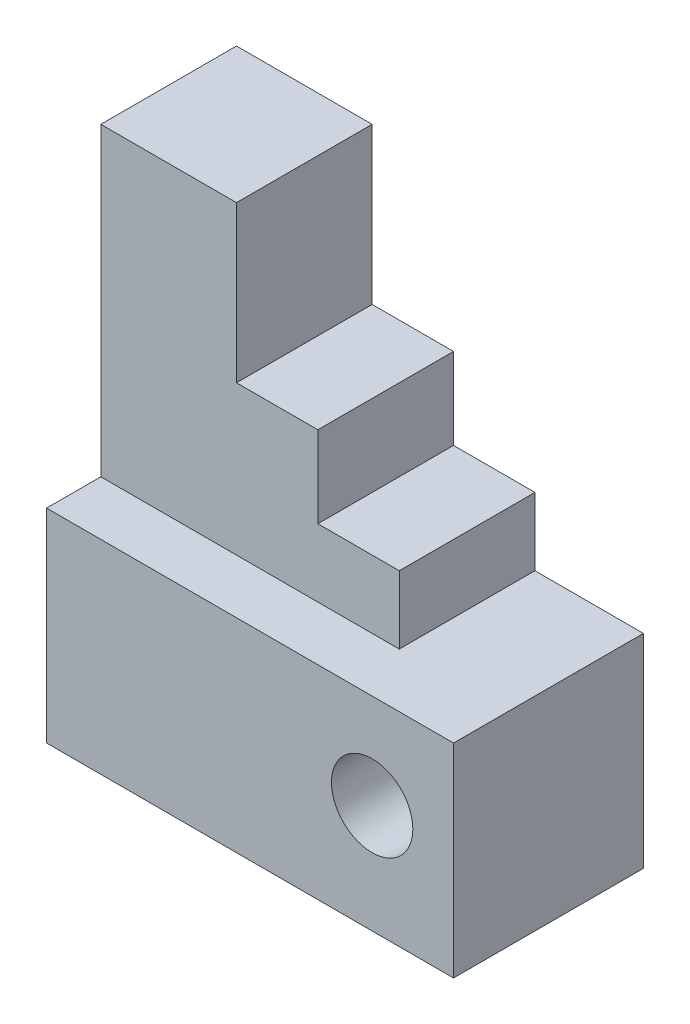
ISO-10303-21;
HEADER;
FILE_DESCRIPTION(('STEP AP214'),'2;1');
FILE_NAME('part.step','',(''),(''),'','','');
FILE_SCHEMA(('AUTOMOTIVE_DESIGN { 1 0 10303 214 1 1 1 1 }'));
ENDSEC;
DATA;
#1=APPLICATION_CONTEXT('core data for automotive mechanical design processes');
#2=APPLICATION_PROTOCOL_DEFINITION('international standard','automotive_design',2000,#1);
#3=PRODUCT_CONTEXT('',#1,'mechanical');
#4=PRODUCT('Part','Part','',(#3));
#5=PRODUCT_RELATED_PRODUCT_CATEGORY('part','',(#4));
#6=PRODUCT_DEFINITION_FORMATION('','',#4);
#7=PRODUCT_DEFINITION_CONTEXT('part definition',#1,'design');
#8=PRODUCT_DEFINITION('design','',#6,#7);
#9=PRODUCT_DEFINITION_SHAPE('','',#8);
#10=(LENGTH_UNIT() NAMED_UNIT(*) SI_UNIT(.MILLI.,.METRE.));
#11=(NAMED_UNIT(*) PLANE_ANGLE_UNIT() SI_UNIT($,.RADIAN.));
#12=(NAMED_UNIT(*) SI_UNIT($,.STERADIAN.) SOLID_ANGLE_UNIT());
#13=UNCERTAINTY_MEASURE_WITH_UNIT(LENGTH_MEASURE(1.E-05),#10,'distance_accuracy_value','');
#14=(GEOMETRIC_REPRESENTATION_CONTEXT(3) GLOBAL_UNCERTAINTY_ASSIGNED_CONTEXT((#13)) GLOBAL_UNIT_ASSIGNED_CONTEXT((#10,
#11,#12)) REPRESENTATION_CONTEXT('',''));
#15=CARTESIAN_POINT('',(0.,0.,0.));
#16=DIRECTION('',(0.,0.,1.));
#17=DIRECTION('',(1.,0.,0.));
#18=AXIS2_PLACEMENT_3D('',#15,#16,#17);
#19=CARTESIAN_POINT('',(0.,30.,28.));
#20=DIRECTION('',(0.,-1.,0.));
#21=DIRECTION('',(0.,0.,-1.));
#22=AXIS2_PLACEMENT_3D('',#19,#20,#21);
#23=PLANE('',#22);
#24=DIRECTION('',(0.,0.,-1.));
#25=VECTOR('',#24,1.);
#26=CARTESIAN_POINT('',(44.,30.,20.));
#27=LINE('',#26,#25);
#28=CARTESIAN_POINT('',(44.,30.,20.));
#29=VERTEX_POINT('',#28);
#30=CARTESIAN_POINT('',(44.,30.,0.));
#31=VERTEX_POINT('',#30);
#32=EDGE_CURVE('E128',#29,#31,#27,.T.);
#33=ORIENTED_EDGE('',*,*,#32,.F.);
#34=DIRECTION('',(1.,0.,0.));
#35=VECTOR('',#34,1.);
#36=CARTESIAN_POINT('',(44.,30.,20.));
#37=LINE('',#36,#35);
#38=CARTESIAN_POINT('',(0.,30.,20.));
#39=VERTEX_POINT('',#38);
#40=EDGE_CURVE('E61',#39,#29,#37,.T.);
#41=ORIENTED_EDGE('',*,*,#40,.F.);
#42=DIRECTION('',(0.,0.,-1.));
#43=VECTOR('',#42,1.);
#44=CARTESIAN_POINT('',(0.,30.,28.));
#45=LINE('',#44,#43);
#46=CARTESIAN_POINT('',(0.,30.,28.));
#47=VERTEX_POINT('',#46);
#48=EDGE_CURVE('E229',#47,#39,#45,.T.);
#49=ORIENTED_EDGE('',*,*,#48,.F.);
#50=DIRECTION('',(-1.,0.,0.));
#51=VECTOR('',#50,1.);
#52=CARTESIAN_POINT('',(0.,30.,28.));
#53=LINE('',#52,#51);
#54=CARTESIAN_POINT('',(60.,30.,28.));
#55=VERTEX_POINT('',#54);
#56=EDGE_CURVE('E226',#55,#47,#53,.T.);
#57=ORIENTED_EDGE('',*,*,#56,.F.);
#58=DIRECTION('',(0.,0.,-1.));
#59=VECTOR('',#58,1.);
#60=CARTESIAN_POINT('',(60.,30.,28.));
#61=LINE('',#60,#59);
#62=CARTESIAN_POINT('',(60.,30.,0.));
#63=VERTEX_POINT('',#62);
#64=EDGE_CURVE('E243',#55,#63,#61,.T.);
#65=ORIENTED_EDGE('',*,*,#64,.T.);
#66=DIRECTION('',(-1.,0.,0.));
#67=VECTOR('',#66,1.);
#68=CARTESIAN_POINT('',(0.,30.,0.));
#69=LINE('',#68,#67);
#70=EDGE_CURVE('E67',#63,#31,#69,.T.);
#71=ORIENTED_EDGE('',*,*,#70,.T.);
#72=EDGE_LOOP('',(#33,#41,#49,#57,#65,#71));
#73=FACE_BOUND('',#72,.T.);
#74=ADVANCED_FACE('F45',(#73),#23,.F.);
#75=CARTESIAN_POINT('',(0.,0.,28.));
#76=DIRECTION('',(0.,0.,-1.));
#77=DIRECTION('',(-1.,0.,0.));
#78=AXIS2_PLACEMENT_3D('',#75,#76,#77);
#79=PLANE('',#78);
#80=DIRECTION('',(0.,-1.,0.));
#81=VECTOR('',#80,1.);
#82=CARTESIAN_POINT('',(0.,0.,28.));
#83=LINE('',#82,#81);
#84=CARTESIAN_POINT('',(0.,0.,28.));
#85=VERTEX_POINT('',#84);
#86=EDGE_CURVE('E216',#47,#85,#83,.T.);
#87=ORIENTED_EDGE('',*,*,#86,.T.);
#88=DIRECTION('',(1.,0.,0.));
#89=VECTOR('',#88,1.);
#90=CARTESIAN_POINT('',(0.,0.,28.));
#91=LINE('',#90,#89);
#92=CARTESIAN_POINT('',(60.,0.,28.));
#93=VERTEX_POINT('',#92);
#94=EDGE_CURVE('E220',#85,#93,#91,.T.);
#95=ORIENTED_EDGE('',*,*,#94,.T.);
#96=DIRECTION('',(0.,1.,0.));
#97=VECTOR('',#96,1.);
#98=CARTESIAN_POINT('',(60.,0.,28.));
#99=LINE('',#98,#97);
#100=EDGE_CURVE('E223',#93,#55,#99,.T.);
#101=ORIENTED_EDGE('',*,*,#100,.T.);
#102=ORIENTED_EDGE('',*,*,#56,.T.);
#103=EDGE_LOOP('',(#87,#95,#101,#102));
#104=FACE_BOUND('',#103,.T.);
#105=CARTESIAN_POINT('',(48.,16.,28.));
#106=DIRECTION('',(0.,0.,1.));
#107=DIRECTION('',(1.,0.,0.));
#108=AXIS2_PLACEMENT_3D('',#105,#106,#107);
#109=CIRCLE('',#108,6.);
#110=CARTESIAN_POINT('',(54.,16.,28.));
#111=VERTEX_POINT('',#110);
#112=EDGE_CURVE('E208',#111,#111,#109,.T.);
#113=ORIENTED_EDGE('',*,*,#112,.F.);
#114=EDGE_LOOP('',(#113));
#115=FACE_BOUND('',#114,.T.);
#116=ADVANCED_FACE('F286',(#104,#115),#79,.F.);
#117=CARTESIAN_POINT('',(0.,0.,0.));
#118=DIRECTION('',(0.,0.,-1.));
#119=DIRECTION('',(-1.,0.,0.));
#120=AXIS2_PLACEMENT_3D('',#117,#118,#119);
#121=PLANE('',#120);
#122=DIRECTION('',(0.,-1.,0.));
#123=VECTOR('',#122,1.);
#124=CARTESIAN_POINT('',(0.,0.,0.));
#125=LINE('',#124,#123);
#126=CARTESIAN_POINT('',(0.,75.,0.));
#127=VERTEX_POINT('',#126);
#128=CARTESIAN_POINT('',(0.,0.,0.));
#129=VERTEX_POINT('',#128);
#130=EDGE_CURVE('E212',#127,#129,#125,.T.);
#131=ORIENTED_EDGE('',*,*,#130,.F.);
#132=DIRECTION('',(-1.,0.,0.));
#133=VECTOR('',#132,1.);
#134=CARTESIAN_POINT('',(20.,75.,0.));
#135=LINE('',#134,#133);
#136=CARTESIAN_POINT('',(20.,75.,0.));
#137=VERTEX_POINT('',#136);
#138=EDGE_CURVE('E149',#137,#127,#135,.T.);
#139=ORIENTED_EDGE('',*,*,#138,.F.);
#140=DIRECTION('',(0.,1.,0.));
#141=VECTOR('',#140,1.);
#142=CARTESIAN_POINT('',(20.,52.,0.));
#143=LINE('',#142,#141);
#144=CARTESIAN_POINT('',(20.,52.,0.));
#145=VERTEX_POINT('',#144);
#146=EDGE_CURVE('E153',#145,#137,#143,.T.);
#147=ORIENTED_EDGE('',*,*,#146,.F.);
#148=DIRECTION('',(-1.,0.,0.));
#149=VECTOR('',#148,1.);
#150=CARTESIAN_POINT('',(32.,52.,0.));
#151=LINE('',#150,#149);
#152=CARTESIAN_POINT('',(32.,52.,0.));
#153=VERTEX_POINT('',#152);
#154=EDGE_CURVE('E182',#153,#145,#151,.T.);
#155=ORIENTED_EDGE('',*,*,#154,.F.);
#156=DIRECTION('',(0.,1.,0.));
#157=VECTOR('',#156,1.);
#158=CARTESIAN_POINT('',(32.,40.,0.));
#159=LINE('',#158,#157);
#160=CARTESIAN_POINT('',(32.,40.,0.));
#161=VERTEX_POINT('',#160);
#162=EDGE_CURVE('E179',#161,#153,#159,.T.);
#163=ORIENTED_EDGE('',*,*,#162,.F.);
#164=DIRECTION('',(-1.,0.,0.));
#165=VECTOR('',#164,1.);
#166=CARTESIAN_POINT('',(44.,40.,0.));
#167=LINE('',#166,#165);
#168=CARTESIAN_POINT('',(44.,40.,0.));
#169=VERTEX_POINT('',#168);
#170=EDGE_CURVE('E176',#169,#161,#167,.T.);
#171=ORIENTED_EDGE('',*,*,#170,.F.);
#172=DIRECTION('',(0.,1.,0.));
#173=VECTOR('',#172,1.);
#174=CARTESIAN_POINT('',(44.,30.,0.));
#175=LINE('',#174,#173);
#176=EDGE_CURVE('E173',#31,#169,#175,.T.);
#177=ORIENTED_EDGE('',*,*,#176,.F.);
#178=ORIENTED_EDGE('',*,*,#70,.F.);
#179=DIRECTION('',(0.,1.,0.));
#180=VECTOR('',#179,1.);
#181=CARTESIAN_POINT('',(60.,0.,0.));
#182=LINE('',#181,#180);
#183=CARTESIAN_POINT('',(60.,0.,0.));
#184=VERTEX_POINT('',#183);
#185=EDGE_CURVE('E236',#184,#63,#182,.T.);
#186=ORIENTED_EDGE('',*,*,#185,.F.);
#187=DIRECTION('',(1.,0.,0.));
#188=VECTOR('',#187,1.);
#189=CARTESIAN_POINT('',(0.,0.,0.));
#190=LINE('',#189,#188);
#191=EDGE_CURVE('E233',#129,#184,#190,.T.);
#192=ORIENTED_EDGE('',*,*,#191,.F.);
#193=EDGE_LOOP('',(#131,#139,#147,#155,#163,#171,#177,#178,#186,#192));
#194=FACE_BOUND('',#193,.T.);
#195=CARTESIAN_POINT('',(48.,16.,0.));
#196=DIRECTION('',(0.,0.,1.));
#197=DIRECTION('',(1.,0.,0.));
#198=AXIS2_PLACEMENT_3D('',#195,#196,#197);
#199=CIRCLE('',#198,6.);
#200=CARTESIAN_POINT('',(54.,16.,0.));
#201=VERTEX_POINT('',#200);
#202=EDGE_CURVE('E132',#201,#201,#199,.T.);
#203=ORIENTED_EDGE('',*,*,#202,.T.);
#204=EDGE_LOOP('',(#203));
#205=FACE_BOUND('',#204,.T.);
#206=ADVANCED_FACE('F255',(#194,#205),#121,.T.);
#207=CARTESIAN_POINT('',(0.,0.,28.));
#208=DIRECTION('',(1.,0.,0.));
#209=DIRECTION('',(0.,0.,-1.));
#210=AXIS2_PLACEMENT_3D('',#207,#208,#209);
#211=PLANE('',#210);
#212=ORIENTED_EDGE('',*,*,#130,.T.);
#213=DIRECTION('',(0.,0.,-1.));
#214=VECTOR('',#213,1.);
#215=CARTESIAN_POINT('',(0.,0.,28.));
#216=LINE('',#215,#214);
#217=EDGE_CURVE('E11',#85,#129,#216,.T.);
#218=ORIENTED_EDGE('',*,*,#217,.F.);
#219=ORIENTED_EDGE('',*,*,#86,.F.);
#220=ORIENTED_EDGE('',*,*,#48,.T.);
#221=DIRECTION('',(0.,-1.,0.));
#222=VECTOR('',#221,1.);
#223=CARTESIAN_POINT('',(0.,75.,20.));
#224=LINE('',#223,#222);
#225=CARTESIAN_POINT('',(0.,75.,20.));
#226=VERTEX_POINT('',#225);
#227=EDGE_CURVE('E147',#226,#39,#224,.T.);
#228=ORIENTED_EDGE('',*,*,#227,.F.);
#229=DIRECTION('',(0.,0.,-1.));
#230=VECTOR('',#229,1.);
#231=CARTESIAN_POINT('',(0.,75.,20.));
#232=LINE('',#231,#230);
#233=EDGE_CURVE('E172',#226,#127,#232,.T.);
#234=ORIENTED_EDGE('',*,*,#233,.T.);
#235=EDGE_LOOP('',(#212,#218,#219,#220,#228,#234));
#236=FACE_BOUND('',#235,.T.);
#237=ADVANCED_FACE('F47',(#236),#211,.F.);
#238=CARTESIAN_POINT('',(0.,0.,28.));
#239=DIRECTION('',(0.,1.,0.));
#240=DIRECTION('',(0.,0.,1.));
#241=AXIS2_PLACEMENT_3D('',#238,#239,#240);
#242=PLANE('',#241);
#243=ORIENTED_EDGE('',*,*,#191,.T.);
#244=DIRECTION('',(0.,0.,-1.));
#245=VECTOR('',#244,1.);
#246=CARTESIAN_POINT('',(60.,0.,28.));
#247=LINE('',#246,#245);
#248=EDGE_CURVE('E54',#93,#184,#247,.T.);
#249=ORIENTED_EDGE('',*,*,#248,.F.);
#250=ORIENTED_EDGE('',*,*,#94,.F.);
#251=ORIENTED_EDGE('',*,*,#217,.T.);
#252=EDGE_LOOP('',(#243,#249,#250,#251));
#253=FACE_BOUND('',#252,.T.);
#254=ADVANCED_FACE('F288',(#253),#242,.F.);
#255=CARTESIAN_POINT('',(60.,0.,28.));
#256=DIRECTION('',(-1.,0.,0.));
#257=DIRECTION('',(0.,0.,1.));
#258=AXIS2_PLACEMENT_3D('',#255,#256,#257);
#259=PLANE('',#258);
#260=ORIENTED_EDGE('',*,*,#185,.T.);
#261=ORIENTED_EDGE('',*,*,#64,.F.);
#262=ORIENTED_EDGE('',*,*,#100,.F.);
#263=ORIENTED_EDGE('',*,*,#248,.T.);
#264=EDGE_LOOP('',(#260,#261,#262,#263));
#265=FACE_BOUND('',#264,.T.);
#266=ADVANCED_FACE('F251',(#265),#259,.F.);
#267=CARTESIAN_POINT('',(48.,16.,28.));
#268=DIRECTION('',(0.,0.,-1.));
#269=DIRECTION('',(-1.,0.,0.));
#270=AXIS2_PLACEMENT_3D('',#267,#268,#269);
#271=CYLINDRICAL_SURFACE('',#270,6.);
#272=ORIENTED_EDGE('',*,*,#112,.T.);
#273=EDGE_LOOP('',(#272));
#274=FACE_BOUND('',#273,.T.);
#275=ORIENTED_EDGE('',*,*,#202,.F.);
#276=EDGE_LOOP('',(#275));
#277=FACE_BOUND('',#276,.T.);
#278=ADVANCED_FACE('F294',(#274,#277),#271,.F.);
#279=CARTESIAN_POINT('',(44.,30.,20.));
#280=DIRECTION('',(-1.,0.,0.));
#281=DIRECTION('',(0.,0.,1.));
#282=AXIS2_PLACEMENT_3D('',#279,#280,#281);
#283=PLANE('',#282);
#284=ORIENTED_EDGE('',*,*,#176,.T.);
#285=DIRECTION('',(0.,0.,-1.));
#286=VECTOR('',#285,1.);
#287=CARTESIAN_POINT('',(44.,40.,20.));
#288=LINE('',#287,#286);
#289=CARTESIAN_POINT('',(44.,40.,20.));
#290=VERTEX_POINT('',#289);
#291=EDGE_CURVE('E133',#290,#169,#288,.T.);
#292=ORIENTED_EDGE('',*,*,#291,.F.);
#293=DIRECTION('',(0.,1.,0.));
#294=VECTOR('',#293,1.);
#295=CARTESIAN_POINT('',(44.,30.,20.));
#296=LINE('',#295,#294);
#297=EDGE_CURVE('E136',#29,#290,#296,.T.);
#298=ORIENTED_EDGE('',*,*,#297,.F.);
#299=ORIENTED_EDGE('',*,*,#32,.T.);
#300=EDGE_LOOP('',(#284,#292,#298,#299));
#301=FACE_BOUND('',#300,.T.);
#302=ADVANCED_FACE('F137',(#301),#283,.F.);
#303=CARTESIAN_POINT('',(44.,40.,20.));
#304=DIRECTION('',(0.,-1.,0.));
#305=DIRECTION('',(0.,0.,-1.));
#306=AXIS2_PLACEMENT_3D('',#303,#304,#305);
#307=PLANE('',#306);
#308=ORIENTED_EDGE('',*,*,#170,.T.);
#309=DIRECTION('',(0.,0.,-1.));
#310=VECTOR('',#309,1.);
#311=CARTESIAN_POINT('',(32.,40.,20.));
#312=LINE('',#311,#310);
#313=CARTESIAN_POINT('',(32.,40.,20.));
#314=VERTEX_POINT('',#313);
#315=EDGE_CURVE('E202',#314,#161,#312,.T.);
#316=ORIENTED_EDGE('',*,*,#315,.F.);
#317=DIRECTION('',(-1.,0.,0.));
#318=VECTOR('',#317,1.);
#319=CARTESIAN_POINT('',(44.,40.,20.));
#320=LINE('',#319,#318);
#321=EDGE_CURVE('E142',#290,#314,#320,.T.);
#322=ORIENTED_EDGE('',*,*,#321,.F.);
#323=ORIENTED_EDGE('',*,*,#291,.T.);
#324=EDGE_LOOP('',(#308,#316,#322,#323));
#325=FACE_BOUND('',#324,.T.);
#326=ADVANCED_FACE('F260',(#325),#307,.F.);
#327=CARTESIAN_POINT('',(32.,40.,20.));
#328=DIRECTION('',(-1.,0.,0.));
#329=DIRECTION('',(0.,0.,1.));
#330=AXIS2_PLACEMENT_3D('',#327,#328,#329);
#331=PLANE('',#330);
#332=ORIENTED_EDGE('',*,*,#162,.T.);
#333=DIRECTION('',(0.,0.,-1.));
#334=VECTOR('',#333,1.);
#335=CARTESIAN_POINT('',(32.,52.,20.));
#336=LINE('',#335,#334);
#337=CARTESIAN_POINT('',(32.,52.,20.));
#338=VERTEX_POINT('',#337);
#339=EDGE_CURVE('E198',#338,#153,#336,.T.);
#340=ORIENTED_EDGE('',*,*,#339,.F.);
#341=DIRECTION('',(0.,1.,0.));
#342=VECTOR('',#341,1.);
#343=CARTESIAN_POINT('',(32.,40.,20.));
#344=LINE('',#343,#342);
#345=EDGE_CURVE('E158',#314,#338,#344,.T.);
#346=ORIENTED_EDGE('',*,*,#345,.F.);
#347=ORIENTED_EDGE('',*,*,#315,.T.);
#348=EDGE_LOOP('',(#332,#340,#346,#347));
#349=FACE_BOUND('',#348,.T.);
#350=ADVANCED_FACE('F267',(#349),#331,.F.);
#351=CARTESIAN_POINT('',(32.,52.,20.));
#352=DIRECTION('',(0.,-1.,0.));
#353=DIRECTION('',(0.,0.,-1.));
#354=AXIS2_PLACEMENT_3D('',#351,#352,#353);
#355=PLANE('',#354);
#356=ORIENTED_EDGE('',*,*,#154,.T.);
#357=DIRECTION('',(0.,0.,-1.));
#358=VECTOR('',#357,1.);
#359=CARTESIAN_POINT('',(20.,52.,20.));
#360=LINE('',#359,#358);
#361=CARTESIAN_POINT('',(20.,52.,20.));
#362=VERTEX_POINT('',#361);
#363=EDGE_CURVE('E194',#362,#145,#360,.T.);
#364=ORIENTED_EDGE('',*,*,#363,.F.);
#365=DIRECTION('',(-1.,0.,0.));
#366=VECTOR('',#365,1.);
#367=CARTESIAN_POINT('',(32.,52.,20.));
#368=LINE('',#367,#366);
#369=EDGE_CURVE('E161',#338,#362,#368,.T.);
#370=ORIENTED_EDGE('',*,*,#369,.F.);
#371=ORIENTED_EDGE('',*,*,#339,.T.);
#372=EDGE_LOOP('',(#356,#364,#370,#371));
#373=FACE_BOUND('',#372,.T.);
#374=ADVANCED_FACE('F270',(#373),#355,.F.);
#375=CARTESIAN_POINT('',(20.,52.,20.));
#376=DIRECTION('',(-1.,0.,0.));
#377=DIRECTION('',(0.,0.,1.));
#378=AXIS2_PLACEMENT_3D('',#375,#376,#377);
#379=PLANE('',#378);
#380=ORIENTED_EDGE('',*,*,#146,.T.);
#381=DIRECTION('',(0.,0.,-1.));
#382=VECTOR('',#381,1.);
#383=CARTESIAN_POINT('',(20.,75.,20.));
#384=LINE('',#383,#382);
#385=CARTESIAN_POINT('',(20.,75.,20.));
#386=VERTEX_POINT('',#385);
#387=EDGE_CURVE('E190',#386,#137,#384,.T.);
#388=ORIENTED_EDGE('',*,*,#387,.F.);
#389=DIRECTION('',(0.,1.,0.));
#390=VECTOR('',#389,1.);
#391=CARTESIAN_POINT('',(20.,52.,20.));
#392=LINE('',#391,#390);
#393=EDGE_CURVE('E164',#362,#386,#392,.T.);
#394=ORIENTED_EDGE('',*,*,#393,.F.);
#395=ORIENTED_EDGE('',*,*,#363,.T.);
#396=EDGE_LOOP('',(#380,#388,#394,#395));
#397=FACE_BOUND('',#396,.T.);
#398=ADVANCED_FACE('F275',(#397),#379,.F.);
#399=CARTESIAN_POINT('',(20.,75.,20.));
#400=DIRECTION('',(0.,-1.,0.));
#401=DIRECTION('',(0.,0.,-1.));
#402=AXIS2_PLACEMENT_3D('',#399,#400,#401);
#403=PLANE('',#402);
#404=ORIENTED_EDGE('',*,*,#138,.T.);
#405=ORIENTED_EDGE('',*,*,#233,.F.);
#406=DIRECTION('',(-1.,0.,0.));
#407=VECTOR('',#406,1.);
#408=CARTESIAN_POINT('',(20.,75.,20.));
#409=LINE('',#408,#407);
#410=EDGE_CURVE('E167',#386,#226,#409,.T.);
#411=ORIENTED_EDGE('',*,*,#410,.F.);
#412=ORIENTED_EDGE('',*,*,#387,.T.);
#413=EDGE_LOOP('',(#404,#405,#411,#412));
#414=FACE_BOUND('',#413,.T.);
#415=ADVANCED_FACE('F279',(#414),#403,.F.);
#416=CARTESIAN_POINT('',(0.,0.,20.));
#417=DIRECTION('',(0.,0.,1.));
#418=DIRECTION('',(1.,0.,0.));
#419=AXIS2_PLACEMENT_3D('',#416,#417,#418);
#420=PLANE('',#419);
#421=ORIENTED_EDGE('',*,*,#40,.T.);
#422=ORIENTED_EDGE('',*,*,#297,.T.);
#423=ORIENTED_EDGE('',*,*,#321,.T.);
#424=ORIENTED_EDGE('',*,*,#345,.T.);
#425=ORIENTED_EDGE('',*,*,#369,.T.);
#426=ORIENTED_EDGE('',*,*,#393,.T.);
#427=ORIENTED_EDGE('',*,*,#410,.T.);
#428=ORIENTED_EDGE('',*,*,#227,.T.);
#429=EDGE_LOOP('',(#421,#422,#423,#424,#425,#426,#427,#428));
#430=FACE_BOUND('',#429,.T.);
#431=ADVANCED_FACE('F145',(#430),#420,.T.);
#432=CLOSED_SHELL('',(#74,#116,#206,#237,#254,#266,#278,#302,#326,#350,#374,#398,#415,#431));
#433=MANIFOLD_SOLID_BREP('B2',#432);
#434=ADVANCED_BREP_SHAPE_REPRESENTATION('',(#18,#433),#14);
#435=SHAPE_DEFINITION_REPRESENTATION(#9,#434);
ENDSEC;
END-ISO-10303-21;
